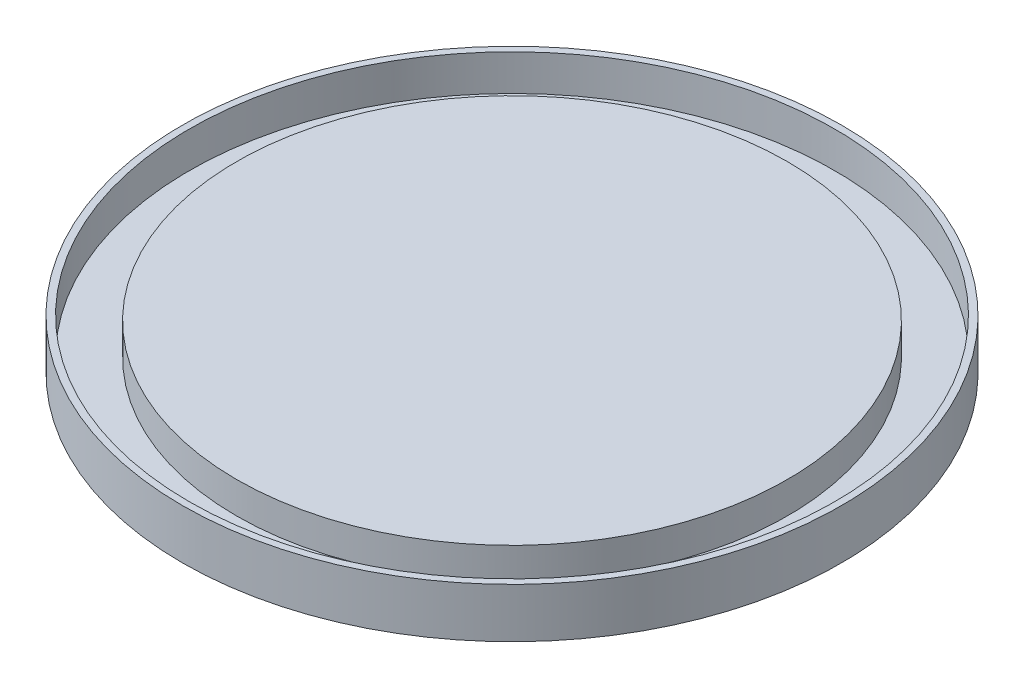
ISO-10303-21;
HEADER;
FILE_DESCRIPTION(('STEP AP214'),'2;1');
FILE_NAME('part.step','',(''),(''),'','','');
FILE_SCHEMA(('AUTOMOTIVE_DESIGN { 1 0 10303 214 1 1 1 1 }'));
ENDSEC;
DATA;
#1=APPLICATION_CONTEXT('core data for automotive mechanical design processes');
#2=APPLICATION_PROTOCOL_DEFINITION('international standard','automotive_design',2000,#1);
#3=PRODUCT_CONTEXT('',#1,'mechanical');
#4=PRODUCT('Part','Part','',(#3));
#5=PRODUCT_RELATED_PRODUCT_CATEGORY('part','',(#4));
#6=PRODUCT_DEFINITION_FORMATION('','',#4);
#7=PRODUCT_DEFINITION_CONTEXT('part definition',#1,'design');
#8=PRODUCT_DEFINITION('design','',#6,#7);
#9=PRODUCT_DEFINITION_SHAPE('','',#8);
#10=(LENGTH_UNIT() NAMED_UNIT(*) SI_UNIT(.MILLI.,.METRE.));
#11=(NAMED_UNIT(*) PLANE_ANGLE_UNIT() SI_UNIT($,.RADIAN.));
#12=(NAMED_UNIT(*) SI_UNIT($,.STERADIAN.) SOLID_ANGLE_UNIT());
#13=UNCERTAINTY_MEASURE_WITH_UNIT(LENGTH_MEASURE(1.E-05),#10,'distance_accuracy_value','');
#14=(GEOMETRIC_REPRESENTATION_CONTEXT(3) GLOBAL_UNCERTAINTY_ASSIGNED_CONTEXT((#13)) GLOBAL_UNIT_ASSIGNED_CONTEXT((#10,
#11,#12)) REPRESENTATION_CONTEXT('',''));
#15=CARTESIAN_POINT('',(0.,0.,0.));
#16=DIRECTION('',(0.,0.,1.));
#17=DIRECTION('',(1.,0.,0.));
#18=AXIS2_PLACEMENT_3D('',#15,#16,#17);
#19=CARTESIAN_POINT('',(0.,10.,0.));
#20=DIRECTION('',(0.,-1.,0.));
#21=DIRECTION('',(0.,0.,-1.));
#22=AXIS2_PLACEMENT_3D('',#19,#20,#21);
#23=CYLINDRICAL_SURFACE('',#22,59.5);
#24=CARTESIAN_POINT('',(0.,7.,0.));
#25=DIRECTION('',(0.,1.,0.));
#26=DIRECTION('',(0.,0.,1.));
#27=AXIS2_PLACEMENT_3D('',#24,#25,#26);
#28=CIRCLE('',#27,59.5);
#29=CARTESIAN_POINT('',(-48.5032342918433,7.,-34.4628243652571));
#30=VERTEX_POINT('',#29);
#31=CARTESIAN_POINT('',(-10.7355735202883,7.,58.5234778630806));
#32=VERTEX_POINT('',#31);
#33=EDGE_CURVE('E216',#30,#32,#28,.T.);
#34=ORIENTED_EDGE('',*,*,#33,.T.);
#35=DIRECTION('',(0.,1.,0.));
#36=VECTOR('',#35,1.);
#37=CARTESIAN_POINT('',(-10.7355735202883,0.,58.5234778630806));
#38=LINE('',#37,#36);
#39=CARTESIAN_POINT('',(-10.7355735202883,0.,58.5234778630806));
#40=VERTEX_POINT('',#39);
#41=EDGE_CURVE('E56',#40,#32,#38,.T.);
#42=ORIENTED_EDGE('',*,*,#41,.F.);
#43=CARTESIAN_POINT('',(0.,0.,0.));
#44=DIRECTION('',(0.,1.,0.));
#45=DIRECTION('',(0.,0.,1.));
#46=AXIS2_PLACEMENT_3D('',#43,#44,#45);
#47=CIRCLE('',#46,59.5);
#48=CARTESIAN_POINT('',(-48.5032342918433,0.,-34.4628243652571));
#49=VERTEX_POINT('',#48);
#50=EDGE_CURVE('E131',#49,#40,#47,.T.);
#51=ORIENTED_EDGE('',*,*,#50,.F.);
#52=DIRECTION('',(0.,1.,0.));
#53=VECTOR('',#52,1.);
#54=CARTESIAN_POINT('',(-48.5032342918433,0.,-34.4628243652571));
#55=LINE('',#54,#53);
#56=EDGE_CURVE('E209',#49,#30,#55,.T.);
#57=ORIENTED_EDGE('',*,*,#56,.T.);
#58=EDGE_LOOP('',(#34,#42,#51,#57));
#59=FACE_BOUND('',#58,.T.);
#60=ADVANCED_FACE('F33',(#59),#23,.F.);
#61=CARTESIAN_POINT('',(54.0972985323959,7.,-24.7736208798156));
#62=VERTEX_POINT('',#61);
#63=CARTESIAN_POINT('',(-45.3150317871002,7.,-38.5590183243051));
#64=VERTEX_POINT('',#63);
#65=EDGE_CURVE('E217',#62,#64,#28,.T.);
#66=ORIENTED_EDGE('',*,*,#65,.T.);
#67=DIRECTION('',(0.,1.,0.));
#68=VECTOR('',#67,1.);
#69=CARTESIAN_POINT('',(-45.3150317871002,0.,-38.5590183243051));
#70=LINE('',#69,#68);
#71=CARTESIAN_POINT('',(-45.3150317871002,0.,-38.5590183243051));
#72=VERTEX_POINT('',#71);
#73=EDGE_CURVE('E206',#72,#64,#70,.T.);
#74=ORIENTED_EDGE('',*,*,#73,.F.);
#75=CARTESIAN_POINT('',(54.0972985323959,0.,-24.7736208798156));
#76=VERTEX_POINT('',#75);
#77=EDGE_CURVE('E219',#76,#72,#47,.T.);
#78=ORIENTED_EDGE('',*,*,#77,.F.);
#79=DIRECTION('',(0.,1.,0.));
#80=VECTOR('',#79,1.);
#81=CARTESIAN_POINT('',(54.0972985323959,0.,-24.7736208798156));
#82=LINE('',#81,#80);
#83=EDGE_CURVE('E198',#76,#62,#82,.T.);
#84=ORIENTED_EDGE('',*,*,#83,.T.);
#85=EDGE_LOOP('',(#66,#74,#78,#84));
#86=FACE_BOUND('',#85,.T.);
#87=ADVANCED_FACE('F270',(#86),#23,.F.);
#88=CARTESIAN_POINT('',(-5.59406424055286,7.,59.2364452450733));
#89=VERTEX_POINT('',#88);
#90=CARTESIAN_POINT('',(56.0506053073884,7.,-19.9644595387745));
#91=VERTEX_POINT('',#90);
#92=EDGE_CURVE('E213',#89,#91,#28,.T.);
#93=ORIENTED_EDGE('',*,*,#92,.T.);
#94=DIRECTION('',(0.,1.,0.));
#95=VECTOR('',#94,1.);
#96=CARTESIAN_POINT('',(56.0506053073884,0.,-19.9644595387745));
#97=LINE('',#96,#95);
#98=CARTESIAN_POINT('',(56.0506053073884,0.,-19.9644595387745));
#99=VERTEX_POINT('',#98);
#100=EDGE_CURVE('E195',#99,#91,#97,.T.);
#101=ORIENTED_EDGE('',*,*,#100,.F.);
#102=CARTESIAN_POINT('',(-5.59406424055287,0.,59.2364452450733));
#103=VERTEX_POINT('',#102);
#104=EDGE_CURVE('E48',#103,#99,#47,.T.);
#105=ORIENTED_EDGE('',*,*,#104,.F.);
#106=DIRECTION('',(0.,1.,0.));
#107=VECTOR('',#106,1.);
#108=CARTESIAN_POINT('',(-5.59406424055286,0.,59.2364452450733));
#109=LINE('',#108,#107);
#110=EDGE_CURVE('E164',#103,#89,#109,.T.);
#111=ORIENTED_EDGE('',*,*,#110,.T.);
#112=EDGE_LOOP('',(#93,#101,#105,#111));
#113=FACE_BOUND('',#112,.T.);
#114=ADVANCED_FACE('F250',(#113),#23,.F.);
#115=CARTESIAN_POINT('',(0.,7.,0.));
#116=DIRECTION('',(0.,1.,0.));
#117=DIRECTION('',(0.,0.,1.));
#118=AXIS2_PLACEMENT_3D('',#115,#116,#117);
#119=PLANE('',#118);
#120=DIRECTION('',(0.18042980706367,0.,-0.983587863245052));
#121=VECTOR('',#120,1.);
#122=CARTESIAN_POINT('',(-1.8042980706367,7.,9.83587863245052));
#123=LINE('',#122,#121);
#124=CARTESIAN_POINT('',(-1.8042980706367,7.,9.83587863245052));
#125=VERTEX_POINT('',#124);
#126=EDGE_CURVE('E139',#32,#125,#123,.T.);
#127=ORIENTED_EDGE('',*,*,#126,.F.);
#128=ORIENTED_EDGE('',*,*,#33,.F.);
#129=DIRECTION('',(-0.815180408266274,0.,-0.579207132189195));
#130=VECTOR('',#129,1.);
#131=CARTESIAN_POINT('',(-48.5032342918433,7.,-34.4628243652571));
#132=LINE('',#131,#130);
#133=CARTESIAN_POINT('',(-8.15180408266274,7.,-5.79207132189195));
#134=VERTEX_POINT('',#133);
#135=EDGE_CURVE('E168',#134,#30,#132,.T.);
#136=ORIENTED_EDGE('',*,*,#135,.F.);
#137=CARTESIAN_POINT('',(0.,7.,0.));
#138=DIRECTION('',(0.,-1.,0.));
#139=DIRECTION('',(0.,0.,-1.));
#140=AXIS2_PLACEMENT_3D('',#137,#138,#139);
#141=CIRCLE('',#140,10.);
#142=EDGE_CURVE('E166',#125,#134,#141,.T.);
#143=ORIENTED_EDGE('',*,*,#142,.F.);
#144=EDGE_LOOP('',(#127,#128,#136,#143));
#145=FACE_BOUND('',#144,.T.);
#146=ADVANCED_FACE('F256',(#145),#119,.F.);
#147=DIRECTION('',(0.76159717289244,0.,0.648050728139582));
#148=VECTOR('',#147,1.);
#149=CARTESIAN_POINT('',(-7.61597172892441,7.,-6.48050728139582));
#150=LINE('',#149,#148);
#151=CARTESIAN_POINT('',(-7.61597172892441,7.,-6.48050728139582));
#152=VERTEX_POINT('',#151);
#153=EDGE_CURVE('E171',#64,#152,#150,.T.);
#154=ORIENTED_EDGE('',*,*,#153,.F.);
#155=ORIENTED_EDGE('',*,*,#65,.F.);
#156=DIRECTION('',(0.909198294662116,0.,-0.416363376131355));
#157=VECTOR('',#156,1.);
#158=CARTESIAN_POINT('',(9.09198294662116,7.,-4.16363376131355));
#159=LINE('',#158,#157);
#160=CARTESIAN_POINT('',(9.09198294662116,7.,-4.16363376131355));
#161=VERTEX_POINT('',#160);
#162=EDGE_CURVE('E177',#161,#62,#159,.T.);
#163=ORIENTED_EDGE('',*,*,#162,.F.);
#164=CARTESIAN_POINT('',(0.,7.,0.));
#165=DIRECTION('',(0.,-1.,0.));
#166=DIRECTION('',(0.,0.,-1.));
#167=AXIS2_PLACEMENT_3D('',#164,#165,#166);
#168=CIRCLE('',#167,10.);
#169=EDGE_CURVE('E174',#152,#161,#168,.T.);
#170=ORIENTED_EDGE('',*,*,#169,.F.);
#171=EDGE_LOOP('',(#154,#155,#163,#170));
#172=FACE_BOUND('',#171,.T.);
#173=ADVANCED_FACE('F254',(#172),#119,.F.);
#174=DIRECTION('',(-0.942026979956107,0.,0.335537135105454));
#175=VECTOR('',#174,1.);
#176=CARTESIAN_POINT('',(9.42026979956107,7.,-3.35537135105454));
#177=LINE('',#176,#175);
#178=CARTESIAN_POINT('',(9.42026979956107,7.,-3.35537135105454));
#179=VERTEX_POINT('',#178);
#180=EDGE_CURVE('E180',#91,#179,#177,.T.);
#181=ORIENTED_EDGE('',*,*,#180,.F.);
#182=ORIENTED_EDGE('',*,*,#92,.F.);
#183=DIRECTION('',(-0.0940178863958465,0.,0.99557050832056));
#184=VECTOR('',#183,1.);
#185=CARTESIAN_POINT('',(-5.59406424055286,7.,59.2364452450733));
#186=LINE('',#185,#184);
#187=CARTESIAN_POINT('',(-0.940178863958465,7.,9.9557050832056));
#188=VERTEX_POINT('',#187);
#189=EDGE_CURVE('E133',#188,#89,#186,.T.);
#190=ORIENTED_EDGE('',*,*,#189,.F.);
#191=CARTESIAN_POINT('',(0.,7.,0.));
#192=DIRECTION('',(0.,-1.,0.));
#193=DIRECTION('',(0.,0.,-1.));
#194=AXIS2_PLACEMENT_3D('',#191,#192,#193);
#195=CIRCLE('',#194,10.);
#196=EDGE_CURVE('E183',#179,#188,#195,.T.);
#197=ORIENTED_EDGE('',*,*,#196,.F.);
#198=EDGE_LOOP('',(#181,#182,#190,#197));
#199=FACE_BOUND('',#198,.T.);
#200=ADVANCED_FACE('F252',(#199),#119,.F.);
#201=CARTESIAN_POINT('',(0.,11.,0.));
#202=DIRECTION('',(0.,1.,0.));
#203=DIRECTION('',(0.,0.,1.));
#204=AXIS2_PLACEMENT_3D('',#201,#202,#203);
#205=PLANE('',#204);
#206=CARTESIAN_POINT('',(0.,11.,0.));
#207=DIRECTION('',(0.,1.,0.));
#208=DIRECTION('',(0.,0.,1.));
#209=AXIS2_PLACEMENT_3D('',#206,#207,#208);
#210=CIRCLE('',#209,73.);
#211=CARTESIAN_POINT('',(0.,11.,73.));
#212=VERTEX_POINT('',#211);
#213=EDGE_CURVE('E41',#212,#212,#210,.T.);
#214=ORIENTED_EDGE('',*,*,#213,.T.);
#215=EDGE_LOOP('',(#214));
#216=FACE_BOUND('',#215,.T.);
#217=CARTESIAN_POINT('',(0.,11.,0.));
#218=DIRECTION('',(0.,1.,0.));
#219=DIRECTION('',(0.,0.,1.));
#220=AXIS2_PLACEMENT_3D('',#217,#218,#219);
#221=CIRCLE('',#220,71.5);
#222=CARTESIAN_POINT('',(0.,11.,71.5));
#223=VERTEX_POINT('',#222);
#224=EDGE_CURVE('E226',#223,#223,#221,.T.);
#225=ORIENTED_EDGE('',*,*,#224,.F.);
#226=EDGE_LOOP('',(#225));
#227=FACE_BOUND('',#226,.T.);
#228=ADVANCED_FACE('F237',(#216,#227),#205,.T.);
#229=CARTESIAN_POINT('',(0.,0.,0.));
#230=DIRECTION('',(0.,1.,0.));
#231=DIRECTION('',(0.,0.,1.));
#232=AXIS2_PLACEMENT_3D('',#229,#230,#231);
#233=PLANE('',#232);
#234=ORIENTED_EDGE('',*,*,#50,.T.);
#235=DIRECTION('',(0.18042980706367,0.,-0.983587863245052));
#236=VECTOR('',#235,1.);
#237=CARTESIAN_POINT('',(-1.8042980706367,0.,9.83587863245052));
#238=LINE('',#237,#236);
#239=CARTESIAN_POINT('',(-1.8042980706367,0.,9.83587863245052));
#240=VERTEX_POINT('',#239);
#241=EDGE_CURVE('E123',#40,#240,#238,.T.);
#242=ORIENTED_EDGE('',*,*,#241,.T.);
#243=CARTESIAN_POINT('',(0.,0.,0.));
#244=DIRECTION('',(0.,-1.,0.));
#245=DIRECTION('',(0.,0.,-1.));
#246=AXIS2_PLACEMENT_3D('',#243,#244,#245);
#247=CIRCLE('',#246,10.);
#248=CARTESIAN_POINT('',(-8.15180408266274,0.,-5.79207132189195));
#249=VERTEX_POINT('',#248);
#250=EDGE_CURVE('E129',#240,#249,#247,.T.);
#251=ORIENTED_EDGE('',*,*,#250,.T.);
#252=DIRECTION('',(-0.815180408266274,0.,-0.579207132189195));
#253=VECTOR('',#252,1.);
#254=CARTESIAN_POINT('',(-48.5032342918433,0.,-34.4628243652571));
#255=LINE('',#254,#253);
#256=EDGE_CURVE('E147',#249,#49,#255,.T.);
#257=ORIENTED_EDGE('',*,*,#256,.T.);
#258=EDGE_LOOP('',(#234,#242,#251,#257));
#259=FACE_BOUND('',#258,.T.);
#260=ORIENTED_EDGE('',*,*,#77,.T.);
#261=DIRECTION('',(0.76159717289244,0.,0.648050728139582));
#262=VECTOR('',#261,1.);
#263=CARTESIAN_POINT('',(-7.61597172892441,0.,-6.48050728139582));
#264=LINE('',#263,#262);
#265=CARTESIAN_POINT('',(-7.61597172892441,0.,-6.48050728139582));
#266=VERTEX_POINT('',#265);
#267=EDGE_CURVE('E149',#72,#266,#264,.T.);
#268=ORIENTED_EDGE('',*,*,#267,.T.);
#269=CARTESIAN_POINT('',(0.,0.,0.));
#270=DIRECTION('',(0.,-1.,0.));
#271=DIRECTION('',(0.,0.,-1.));
#272=AXIS2_PLACEMENT_3D('',#269,#270,#271);
#273=CIRCLE('',#272,10.);
#274=CARTESIAN_POINT('',(9.09198294662116,0.,-4.16363376131355));
#275=VERTEX_POINT('',#274);
#276=EDGE_CURVE('E153',#266,#275,#273,.T.);
#277=ORIENTED_EDGE('',*,*,#276,.T.);
#278=DIRECTION('',(0.909198294662116,0.,-0.416363376131355));
#279=VECTOR('',#278,1.);
#280=CARTESIAN_POINT('',(9.09198294662116,0.,-4.16363376131355));
#281=LINE('',#280,#279);
#282=EDGE_CURVE('E155',#275,#76,#281,.T.);
#283=ORIENTED_EDGE('',*,*,#282,.T.);
#284=EDGE_LOOP('',(#260,#268,#277,#283));
#285=FACE_BOUND('',#284,.T.);
#286=CARTESIAN_POINT('',(0.,0.,0.));
#287=DIRECTION('',(0.,1.,0.));
#288=DIRECTION('',(0.,0.,1.));
#289=AXIS2_PLACEMENT_3D('',#286,#287,#288);
#290=CIRCLE('',#289,73.);
#291=CARTESIAN_POINT('',(0.,0.,73.));
#292=VERTEX_POINT('',#291);
#293=EDGE_CURVE('E229',#292,#292,#290,.T.);
#294=ORIENTED_EDGE('',*,*,#293,.F.);
#295=EDGE_LOOP('',(#294));
#296=FACE_BOUND('',#295,.T.);
#297=ORIENTED_EDGE('',*,*,#104,.T.);
#298=DIRECTION('',(-0.942026979956107,0.,0.335537135105454));
#299=VECTOR('',#298,1.);
#300=CARTESIAN_POINT('',(9.42026979956107,0.,-3.35537135105454));
#301=LINE('',#300,#299);
#302=CARTESIAN_POINT('',(9.42026979956107,0.,-3.35537135105454));
#303=VERTEX_POINT('',#302);
#304=EDGE_CURVE('E158',#99,#303,#301,.T.);
#305=ORIENTED_EDGE('',*,*,#304,.T.);
#306=CARTESIAN_POINT('',(0.,0.,0.));
#307=DIRECTION('',(0.,-1.,0.));
#308=DIRECTION('',(0.,0.,-1.));
#309=AXIS2_PLACEMENT_3D('',#306,#307,#308);
#310=CIRCLE('',#309,10.);
#311=CARTESIAN_POINT('',(-0.940178863958461,0.,9.9557050832056));
#312=VERTEX_POINT('',#311);
#313=EDGE_CURVE('E160',#303,#312,#310,.T.);
#314=ORIENTED_EDGE('',*,*,#313,.T.);
#315=DIRECTION('',(-0.0940178863958465,0.,0.99557050832056));
#316=VECTOR('',#315,1.);
#317=CARTESIAN_POINT('',(-5.59406424055286,0.,59.2364452450733));
#318=LINE('',#317,#316);
#319=EDGE_CURVE('E162',#312,#103,#318,.T.);
#320=ORIENTED_EDGE('',*,*,#319,.T.);
#321=EDGE_LOOP('',(#297,#305,#314,#320));
#322=FACE_BOUND('',#321,.T.);
#323=ADVANCED_FACE('F125',(#259,#285,#296,#322),#233,.F.);
#324=CARTESIAN_POINT('',(0.,11.,0.));
#325=DIRECTION('',(0.,-1.,0.));
#326=DIRECTION('',(0.,0.,-1.));
#327=AXIS2_PLACEMENT_3D('',#324,#325,#326);
#328=CYLINDRICAL_SURFACE('',#327,73.);
#329=ORIENTED_EDGE('',*,*,#213,.F.);
#330=EDGE_LOOP('',(#329));
#331=FACE_BOUND('',#330,.T.);
#332=ORIENTED_EDGE('',*,*,#293,.T.);
#333=EDGE_LOOP('',(#332));
#334=FACE_BOUND('',#333,.T.);
#335=ADVANCED_FACE('F35',(#331,#334),#328,.T.);
#336=CARTESIAN_POINT('',(0.,11.,0.));
#337=DIRECTION('',(0.,-1.,0.));
#338=DIRECTION('',(0.,0.,-1.));
#339=AXIS2_PLACEMENT_3D('',#336,#337,#338);
#340=CYLINDRICAL_SURFACE('',#339,71.5);
#341=CARTESIAN_POINT('',(0.,3.,0.));
#342=DIRECTION('',(0.,1.,0.));
#343=DIRECTION('',(0.,0.,1.));
#344=AXIS2_PLACEMENT_3D('',#341,#342,#343);
#345=CIRCLE('',#344,71.5);
#346=CARTESIAN_POINT('',(0.,3.,71.5));
#347=VERTEX_POINT('',#346);
#348=EDGE_CURVE('E11',#347,#347,#345,.T.);
#349=ORIENTED_EDGE('',*,*,#348,.F.);
#350=EDGE_LOOP('',(#349));
#351=FACE_BOUND('',#350,.T.);
#352=ORIENTED_EDGE('',*,*,#224,.T.);
#353=EDGE_LOOP('',(#352));
#354=FACE_BOUND('',#353,.T.);
#355=ADVANCED_FACE('F328',(#351,#354),#340,.F.);
#356=CARTESIAN_POINT('',(0.,3.,0.));
#357=DIRECTION('',(0.,1.,0.));
#358=DIRECTION('',(0.,0.,1.));
#359=AXIS2_PLACEMENT_3D('',#356,#357,#358);
#360=PLANE('',#359);
#361=ORIENTED_EDGE('',*,*,#348,.T.);
#362=EDGE_LOOP('',(#361));
#363=FACE_BOUND('',#362,.T.);
#364=CARTESIAN_POINT('',(0.,3.,0.));
#365=DIRECTION('',(0.,1.,0.));
#366=DIRECTION('',(0.,0.,1.));
#367=AXIS2_PLACEMENT_3D('',#364,#365,#366);
#368=CIRCLE('',#367,61.);
#369=CARTESIAN_POINT('',(0.,3.,61.));
#370=VERTEX_POINT('',#369);
#371=EDGE_CURVE('E223',#370,#370,#368,.T.);
#372=ORIENTED_EDGE('',*,*,#371,.F.);
#373=EDGE_LOOP('',(#372));
#374=FACE_BOUND('',#373,.T.);
#375=ADVANCED_FACE('F310',(#363,#374),#360,.T.);
#376=CARTESIAN_POINT('',(0.,10.,0.));
#377=DIRECTION('',(0.,1.,0.));
#378=DIRECTION('',(0.,0.,1.));
#379=AXIS2_PLACEMENT_3D('',#376,#377,#378);
#380=PLANE('',#379);
#381=CARTESIAN_POINT('',(0.,10.,0.));
#382=DIRECTION('',(0.,1.,0.));
#383=DIRECTION('',(0.,0.,1.));
#384=AXIS2_PLACEMENT_3D('',#381,#382,#383);
#385=CIRCLE('',#384,61.);
#386=CARTESIAN_POINT('',(0.,10.,61.));
#387=VERTEX_POINT('',#386);
#388=EDGE_CURVE('E220',#387,#387,#385,.T.);
#389=ORIENTED_EDGE('',*,*,#388,.T.);
#390=EDGE_LOOP('',(#389));
#391=FACE_BOUND('',#390,.T.);
#392=ADVANCED_FACE('F303',(#391),#380,.T.);
#393=CARTESIAN_POINT('',(0.,10.,0.));
#394=DIRECTION('',(0.,-1.,0.));
#395=DIRECTION('',(0.,0.,-1.));
#396=AXIS2_PLACEMENT_3D('',#393,#394,#395);
#397=CYLINDRICAL_SURFACE('',#396,61.);
#398=ORIENTED_EDGE('',*,*,#371,.T.);
#399=EDGE_LOOP('',(#398));
#400=FACE_BOUND('',#399,.T.);
#401=ORIENTED_EDGE('',*,*,#388,.F.);
#402=EDGE_LOOP('',(#401));
#403=FACE_BOUND('',#402,.T.);
#404=ADVANCED_FACE('F309',(#400,#403),#397,.T.);
#405=CARTESIAN_POINT('',(-1.8042980706367,0.,9.83587863245052));
#406=DIRECTION('',(0.983587863245052,0.,0.18042980706367));
#407=DIRECTION('',(0.18042980706367,0.,-0.983587863245052));
#408=AXIS2_PLACEMENT_3D('',#405,#406,#407);
#409=PLANE('',#408);
#410=ORIENTED_EDGE('',*,*,#126,.T.);
#411=DIRECTION('',(0.,1.,0.));
#412=VECTOR('',#411,1.);
#413=CARTESIAN_POINT('',(-1.8042980706367,0.,9.83587863245052));
#414=LINE('',#413,#412);
#415=EDGE_CURVE('E137',#240,#125,#414,.T.);
#416=ORIENTED_EDGE('',*,*,#415,.F.);
#417=ORIENTED_EDGE('',*,*,#241,.F.);
#418=ORIENTED_EDGE('',*,*,#41,.T.);
#419=EDGE_LOOP('',(#410,#416,#417,#418));
#420=FACE_BOUND('',#419,.T.);
#421=ADVANCED_FACE('F138',(#420),#409,.F.);
#422=CARTESIAN_POINT('',(0.,0.,0.));
#423=DIRECTION('',(0.,1.,0.));
#424=DIRECTION('',(0.,0.,1.));
#425=AXIS2_PLACEMENT_3D('',#422,#423,#424);
#426=CYLINDRICAL_SURFACE('',#425,10.);
#427=ORIENTED_EDGE('',*,*,#142,.T.);
#428=DIRECTION('',(0.,1.,0.));
#429=VECTOR('',#428,1.);
#430=CARTESIAN_POINT('',(-8.15180408266274,0.,-5.79207132189195));
#431=LINE('',#430,#429);
#432=EDGE_CURVE('E142',#249,#134,#431,.T.);
#433=ORIENTED_EDGE('',*,*,#432,.F.);
#434=ORIENTED_EDGE('',*,*,#250,.F.);
#435=ORIENTED_EDGE('',*,*,#415,.T.);
#436=EDGE_LOOP('',(#427,#433,#434,#435));
#437=FACE_BOUND('',#436,.T.);
#438=ADVANCED_FACE('F144',(#437),#426,.T.);
#439=CARTESIAN_POINT('',(-48.5032342918433,0.,-34.4628243652571));
#440=DIRECTION('',(0.579207132189195,0.,-0.815180408266274));
#441=DIRECTION('',(-0.815180408266274,0.,-0.579207132189195));
#442=AXIS2_PLACEMENT_3D('',#439,#440,#441);
#443=PLANE('',#442);
#444=ORIENTED_EDGE('',*,*,#135,.T.);
#445=ORIENTED_EDGE('',*,*,#56,.F.);
#446=ORIENTED_EDGE('',*,*,#256,.F.);
#447=ORIENTED_EDGE('',*,*,#432,.T.);
#448=EDGE_LOOP('',(#444,#445,#446,#447));
#449=FACE_BOUND('',#448,.T.);
#450=ADVANCED_FACE('F383',(#449),#443,.F.);
#451=CARTESIAN_POINT('',(-7.61597172892441,0.,-6.48050728139582));
#452=DIRECTION('',(-0.648050728139582,0.,0.76159717289244));
#453=DIRECTION('',(0.76159717289244,0.,0.648050728139582));
#454=AXIS2_PLACEMENT_3D('',#451,#452,#453);
#455=PLANE('',#454);
#456=ORIENTED_EDGE('',*,*,#153,.T.);
#457=DIRECTION('',(0.,1.,0.));
#458=VECTOR('',#457,1.);
#459=CARTESIAN_POINT('',(-7.61597172892441,0.,-6.48050728139582));
#460=LINE('',#459,#458);
#461=EDGE_CURVE('E203',#266,#152,#460,.T.);
#462=ORIENTED_EDGE('',*,*,#461,.F.);
#463=ORIENTED_EDGE('',*,*,#267,.F.);
#464=ORIENTED_EDGE('',*,*,#73,.T.);
#465=EDGE_LOOP('',(#456,#462,#463,#464));
#466=FACE_BOUND('',#465,.T.);
#467=ADVANCED_FACE('F391',(#466),#455,.F.);
#468=CARTESIAN_POINT('',(0.,0.,0.));
#469=DIRECTION('',(0.,1.,0.));
#470=DIRECTION('',(0.,0.,1.));
#471=AXIS2_PLACEMENT_3D('',#468,#469,#470);
#472=CYLINDRICAL_SURFACE('',#471,10.);
#473=ORIENTED_EDGE('',*,*,#169,.T.);
#474=DIRECTION('',(0.,1.,0.));
#475=VECTOR('',#474,1.);
#476=CARTESIAN_POINT('',(9.09198294662116,0.,-4.16363376131355));
#477=LINE('',#476,#475);
#478=EDGE_CURVE('E200',#275,#161,#477,.T.);
#479=ORIENTED_EDGE('',*,*,#478,.F.);
#480=ORIENTED_EDGE('',*,*,#276,.F.);
#481=ORIENTED_EDGE('',*,*,#461,.T.);
#482=EDGE_LOOP('',(#473,#479,#480,#481));
#483=FACE_BOUND('',#482,.T.);
#484=ADVANCED_FACE('F400',(#483),#472,.T.);
#485=CARTESIAN_POINT('',(9.09198294662116,0.,-4.16363376131355));
#486=DIRECTION('',(0.416363376131355,0.,0.909198294662116));
#487=DIRECTION('',(0.909198294662116,0.,-0.416363376131355));
#488=AXIS2_PLACEMENT_3D('',#485,#486,#487);
#489=PLANE('',#488);
#490=ORIENTED_EDGE('',*,*,#162,.T.);
#491=ORIENTED_EDGE('',*,*,#83,.F.);
#492=ORIENTED_EDGE('',*,*,#282,.F.);
#493=ORIENTED_EDGE('',*,*,#478,.T.);
#494=EDGE_LOOP('',(#490,#491,#492,#493));
#495=FACE_BOUND('',#494,.T.);
#496=ADVANCED_FACE('F409',(#495),#489,.F.);
#497=CARTESIAN_POINT('',(9.42026979956107,0.,-3.35537135105454));
#498=DIRECTION('',(-0.335537135105454,0.,-0.942026979956107));
#499=DIRECTION('',(-0.942026979956107,0.,0.335537135105454));
#500=AXIS2_PLACEMENT_3D('',#497,#498,#499);
#501=PLANE('',#500);
#502=ORIENTED_EDGE('',*,*,#180,.T.);
#503=DIRECTION('',(0.,1.,0.));
#504=VECTOR('',#503,1.);
#505=CARTESIAN_POINT('',(9.42026979956107,0.,-3.35537135105454));
#506=LINE('',#505,#504);
#507=EDGE_CURVE('E192',#303,#179,#506,.T.);
#508=ORIENTED_EDGE('',*,*,#507,.F.);
#509=ORIENTED_EDGE('',*,*,#304,.F.);
#510=ORIENTED_EDGE('',*,*,#100,.T.);
#511=EDGE_LOOP('',(#502,#508,#509,#510));
#512=FACE_BOUND('',#511,.T.);
#513=ADVANCED_FACE('F243',(#512),#501,.F.);
#514=CARTESIAN_POINT('',(0.,0.,0.));
#515=DIRECTION('',(0.,1.,0.));
#516=DIRECTION('',(0.,0.,1.));
#517=AXIS2_PLACEMENT_3D('',#514,#515,#516);
#518=CYLINDRICAL_SURFACE('',#517,10.);
#519=ORIENTED_EDGE('',*,*,#196,.T.);
#520=DIRECTION('',(0.,1.,0.));
#521=VECTOR('',#520,1.);
#522=CARTESIAN_POINT('',(-0.940178863958461,0.,9.9557050832056));
#523=LINE('',#522,#521);
#524=EDGE_CURVE('E189',#312,#188,#523,.T.);
#525=ORIENTED_EDGE('',*,*,#524,.F.);
#526=ORIENTED_EDGE('',*,*,#313,.F.);
#527=ORIENTED_EDGE('',*,*,#507,.T.);
#528=EDGE_LOOP('',(#519,#525,#526,#527));
#529=FACE_BOUND('',#528,.T.);
#530=ADVANCED_FACE('F247',(#529),#518,.T.);
#531=CARTESIAN_POINT('',(-5.59406424055286,0.,59.2364452450733));
#532=DIRECTION('',(-0.99557050832056,0.,-0.0940178863958464));
#533=DIRECTION('',(-0.0940178863958465,0.,0.99557050832056));
#534=AXIS2_PLACEMENT_3D('',#531,#532,#533);
#535=PLANE('',#534);
#536=ORIENTED_EDGE('',*,*,#189,.T.);
#537=ORIENTED_EDGE('',*,*,#110,.F.);
#538=ORIENTED_EDGE('',*,*,#319,.F.);
#539=ORIENTED_EDGE('',*,*,#524,.T.);
#540=EDGE_LOOP('',(#536,#537,#538,#539));
#541=FACE_BOUND('',#540,.T.);
#542=ADVANCED_FACE('F249',(#541),#535,.F.);
#543=CLOSED_SHELL('',(#60,#87,#114,#146,#173,#200,#228,#323,#335,#355,#375,#392,#404,#421,#438,
#450,#467,#484,#496,#513,#530,#542));
#544=MANIFOLD_SOLID_BREP('B2',#543);
#545=ADVANCED_BREP_SHAPE_REPRESENTATION('',(#18,#544),#14);
#546=SHAPE_DEFINITION_REPRESENTATION(#9,#545);
ENDSEC;
END-ISO-10303-21;
